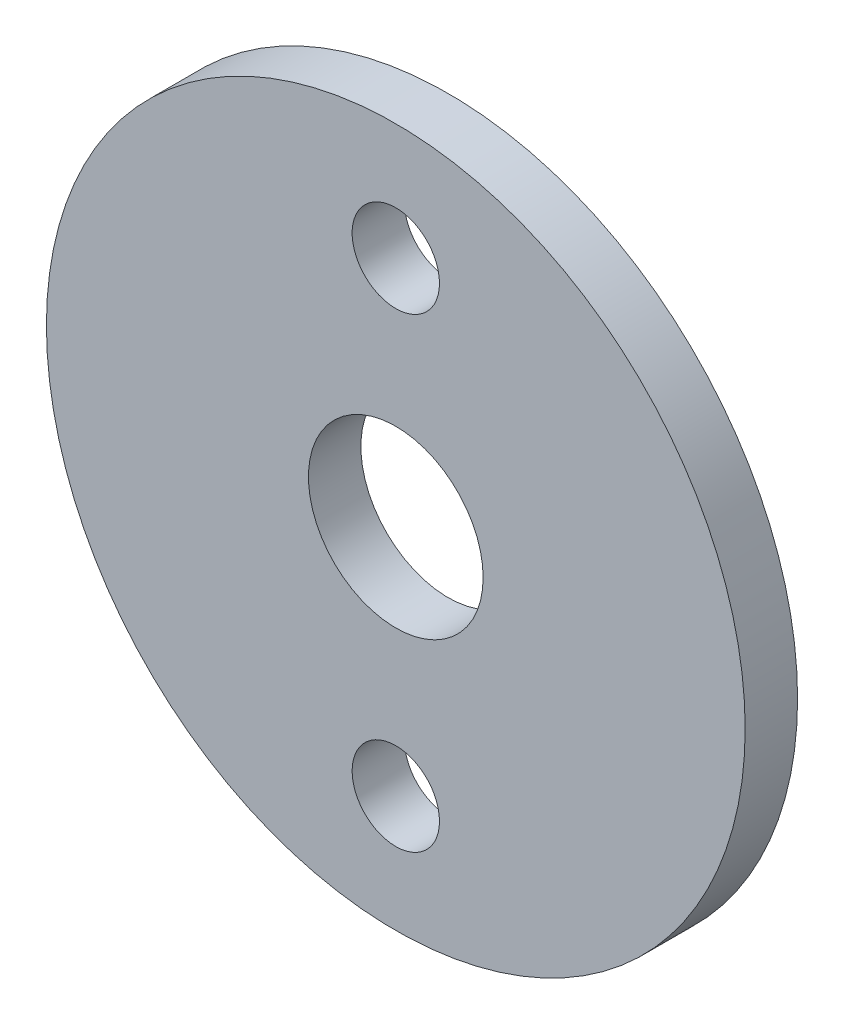
ISO-10303-21;
HEADER;
FILE_DESCRIPTION(('STEP AP214'),'2;1');
FILE_NAME('part.step','',(''),(''),'','','');
FILE_SCHEMA(('AUTOMOTIVE_DESIGN { 1 0 10303 214 1 1 1 1 }'));
ENDSEC;
DATA;
#1=APPLICATION_CONTEXT('core data for automotive mechanical design processes');
#2=APPLICATION_PROTOCOL_DEFINITION('international standard','automotive_design',2000,#1);
#3=PRODUCT_CONTEXT('',#1,'mechanical');
#4=PRODUCT('Part','Part','',(#3));
#5=PRODUCT_RELATED_PRODUCT_CATEGORY('part','',(#4));
#6=PRODUCT_DEFINITION_FORMATION('','',#4);
#7=PRODUCT_DEFINITION_CONTEXT('part definition',#1,'design');
#8=PRODUCT_DEFINITION('design','',#6,#7);
#9=PRODUCT_DEFINITION_SHAPE('','',#8);
#10=(LENGTH_UNIT() NAMED_UNIT(*) SI_UNIT(.MILLI.,.METRE.));
#11=(NAMED_UNIT(*) PLANE_ANGLE_UNIT() SI_UNIT($,.RADIAN.));
#12=(NAMED_UNIT(*) SI_UNIT($,.STERADIAN.) SOLID_ANGLE_UNIT());
#13=UNCERTAINTY_MEASURE_WITH_UNIT(LENGTH_MEASURE(1.E-05),#10,'distance_accuracy_value','');
#14=(GEOMETRIC_REPRESENTATION_CONTEXT(3) GLOBAL_UNCERTAINTY_ASSIGNED_CONTEXT((#13)) GLOBAL_UNIT_ASSIGNED_CONTEXT((#10,
#11,#12)) REPRESENTATION_CONTEXT('',''));
#15=CARTESIAN_POINT('',(0.,0.,0.));
#16=DIRECTION('',(0.,0.,1.));
#17=DIRECTION('',(1.,0.,0.));
#18=AXIS2_PLACEMENT_3D('',#15,#16,#17);
#19=CARTESIAN_POINT('',(0.,0.,1.8));
#20=DIRECTION('',(0.,0.,1.));
#21=DIRECTION('',(1.,0.,0.));
#22=AXIS2_PLACEMENT_3D('',#19,#20,#21);
#23=PLANE('',#22);
#24=CARTESIAN_POINT('',(0.,-8.,1.8));
#25=DIRECTION('',(0.,0.,1.));
#26=DIRECTION('',(-1.,0.,0.));
#27=AXIS2_PLACEMENT_3D('',#24,#25,#26);
#28=CIRCLE('',#27,1.5);
#29=CARTESIAN_POINT('',(-1.5,-8.,1.8));
#30=VERTEX_POINT('',#29);
#31=EDGE_CURVE('E59',#30,#30,#28,.T.);
#32=ORIENTED_EDGE('',*,*,#31,.F.);
#33=EDGE_LOOP('',(#32));
#34=FACE_BOUND('',#33,.T.);
#35=CARTESIAN_POINT('',(0.,8.,1.8));
#36=DIRECTION('',(0.,0.,1.));
#37=DIRECTION('',(1.,0.,0.));
#38=AXIS2_PLACEMENT_3D('',#35,#36,#37);
#39=CIRCLE('',#38,1.5);
#40=CARTESIAN_POINT('',(1.5,8.,1.8));
#41=VERTEX_POINT('',#40);
#42=EDGE_CURVE('E53',#41,#41,#39,.T.);
#43=ORIENTED_EDGE('',*,*,#42,.F.);
#44=EDGE_LOOP('',(#43));
#45=FACE_BOUND('',#44,.T.);
#46=CARTESIAN_POINT('',(0.,0.,1.8));
#47=DIRECTION('',(0.,0.,1.));
#48=DIRECTION('',(1.,0.,0.));
#49=AXIS2_PLACEMENT_3D('',#46,#47,#48);
#50=CIRCLE('',#49,12.);
#51=CARTESIAN_POINT('',(12.,0.,1.8));
#52=VERTEX_POINT('',#51);
#53=EDGE_CURVE('E10',#52,#52,#50,.T.);
#54=ORIENTED_EDGE('',*,*,#53,.T.);
#55=EDGE_LOOP('',(#54));
#56=FACE_BOUND('',#55,.T.);
#57=CARTESIAN_POINT('',(0.,0.,1.8));
#58=DIRECTION('',(0.,0.,1.));
#59=DIRECTION('',(1.,0.,0.));
#60=AXIS2_PLACEMENT_3D('',#57,#58,#59);
#61=CIRCLE('',#60,3.);
#62=CARTESIAN_POINT('',(3.,0.,1.8));
#63=VERTEX_POINT('',#62);
#64=EDGE_CURVE('E43',#63,#63,#61,.T.);
#65=ORIENTED_EDGE('',*,*,#64,.F.);
#66=EDGE_LOOP('',(#65));
#67=FACE_BOUND('',#66,.T.);
#68=ADVANCED_FACE('F32',(#34,#45,#56,#67),#23,.T.);
#69=CARTESIAN_POINT('',(0.,0.,0.));
#70=DIRECTION('',(0.,0.,1.));
#71=DIRECTION('',(1.,0.,0.));
#72=AXIS2_PLACEMENT_3D('',#69,#70,#71);
#73=PLANE('',#72);
#74=CARTESIAN_POINT('',(0.,-8.,0.));
#75=DIRECTION('',(0.,0.,1.));
#76=DIRECTION('',(1.,0.,0.));
#77=AXIS2_PLACEMENT_3D('',#74,#75,#76);
#78=CIRCLE('',#77,1.5);
#79=CARTESIAN_POINT('',(1.5,-8.,0.));
#80=VERTEX_POINT('',#79);
#81=EDGE_CURVE('E56',#80,#80,#78,.F.);
#82=ORIENTED_EDGE('',*,*,#81,.F.);
#83=EDGE_LOOP('',(#82));
#84=FACE_BOUND('',#83,.T.);
#85=CARTESIAN_POINT('',(0.,8.,0.));
#86=DIRECTION('',(0.,0.,1.));
#87=DIRECTION('',(1.,0.,0.));
#88=AXIS2_PLACEMENT_3D('',#85,#86,#87);
#89=CIRCLE('',#88,1.5);
#90=CARTESIAN_POINT('',(1.5,8.,0.));
#91=VERTEX_POINT('',#90);
#92=EDGE_CURVE('E48',#91,#91,#89,.F.);
#93=ORIENTED_EDGE('',*,*,#92,.F.);
#94=EDGE_LOOP('',(#93));
#95=FACE_BOUND('',#94,.T.);
#96=CARTESIAN_POINT('',(0.,0.,0.));
#97=DIRECTION('',(0.,0.,1.));
#98=DIRECTION('',(1.,0.,0.));
#99=AXIS2_PLACEMENT_3D('',#96,#97,#98);
#100=CIRCLE('',#99,12.);
#101=CARTESIAN_POINT('',(12.,0.,0.));
#102=VERTEX_POINT('',#101);
#103=EDGE_CURVE('E36',#102,#102,#100,.T.);
#104=ORIENTED_EDGE('',*,*,#103,.F.);
#105=EDGE_LOOP('',(#104));
#106=FACE_BOUND('',#105,.T.);
#107=CARTESIAN_POINT('',(0.,0.,0.));
#108=DIRECTION('',(0.,0.,1.));
#109=DIRECTION('',(1.,0.,0.));
#110=AXIS2_PLACEMENT_3D('',#107,#108,#109);
#111=CIRCLE('',#110,3.);
#112=CARTESIAN_POINT('',(3.,0.,0.));
#113=VERTEX_POINT('',#112);
#114=EDGE_CURVE('E45',#113,#113,#111,.T.);
#115=ORIENTED_EDGE('',*,*,#114,.T.);
#116=EDGE_LOOP('',(#115));
#117=FACE_BOUND('',#116,.T.);
#118=ADVANCED_FACE('F68',(#84,#95,#106,#117),#73,.F.);
#119=CARTESIAN_POINT('',(0.,0.,1.8));
#120=DIRECTION('',(0.,0.,-1.));
#121=DIRECTION('',(-1.,0.,0.));
#122=AXIS2_PLACEMENT_3D('',#119,#120,#121);
#123=CYLINDRICAL_SURFACE('',#122,12.);
#124=ORIENTED_EDGE('',*,*,#53,.F.);
#125=EDGE_LOOP('',(#124));
#126=FACE_BOUND('',#125,.T.);
#127=ORIENTED_EDGE('',*,*,#103,.T.);
#128=EDGE_LOOP('',(#127));
#129=FACE_BOUND('',#128,.T.);
#130=ADVANCED_FACE('F34',(#126,#129),#123,.T.);
#131=CARTESIAN_POINT('',(0.,0.,1.8));
#132=DIRECTION('',(0.,0.,-1.));
#133=DIRECTION('',(-1.,0.,0.));
#134=AXIS2_PLACEMENT_3D('',#131,#132,#133);
#135=CYLINDRICAL_SURFACE('',#134,3.);
#136=ORIENTED_EDGE('',*,*,#64,.T.);
#137=EDGE_LOOP('',(#136));
#138=FACE_BOUND('',#137,.T.);
#139=ORIENTED_EDGE('',*,*,#114,.F.);
#140=EDGE_LOOP('',(#139));
#141=FACE_BOUND('',#140,.T.);
#142=ADVANCED_FACE('F74',(#138,#141),#135,.F.);
#143=CARTESIAN_POINT('',(0.,8.,-0.000999999999999916));
#144=DIRECTION('',(0.,0.,1.));
#145=DIRECTION('',(1.,0.,0.));
#146=AXIS2_PLACEMENT_3D('',#143,#144,#145);
#147=CYLINDRICAL_SURFACE('',#146,1.5);
#148=ORIENTED_EDGE('',*,*,#42,.T.);
#149=EDGE_LOOP('',(#148));
#150=FACE_BOUND('',#149,.T.);
#151=ORIENTED_EDGE('',*,*,#92,.T.);
#152=EDGE_LOOP('',(#151));
#153=FACE_BOUND('',#152,.T.);
#154=ADVANCED_FACE('F77',(#150,#153),#147,.F.);
#155=CARTESIAN_POINT('',(0.,-8.,-0.000999999999999916));
#156=DIRECTION('',(0.,0.,1.));
#157=DIRECTION('',(1.,0.,0.));
#158=AXIS2_PLACEMENT_3D('',#155,#156,#157);
#159=CYLINDRICAL_SURFACE('',#158,1.5);
#160=ORIENTED_EDGE('',*,*,#31,.T.);
#161=EDGE_LOOP('',(#160));
#162=FACE_BOUND('',#161,.T.);
#163=ORIENTED_EDGE('',*,*,#81,.T.);
#164=EDGE_LOOP('',(#163));
#165=FACE_BOUND('',#164,.T.);
#166=ADVANCED_FACE('F63',(#162,#165),#159,.F.);
#167=CLOSED_SHELL('',(#68,#118,#130,#142,#154,#166));
#168=MANIFOLD_SOLID_BREP('B2',#167);
#169=ADVANCED_BREP_SHAPE_REPRESENTATION('',(#18,#168),#14);
#170=SHAPE_DEFINITION_REPRESENTATION(#9,#169);
ENDSEC;
END-ISO-10303-21;
